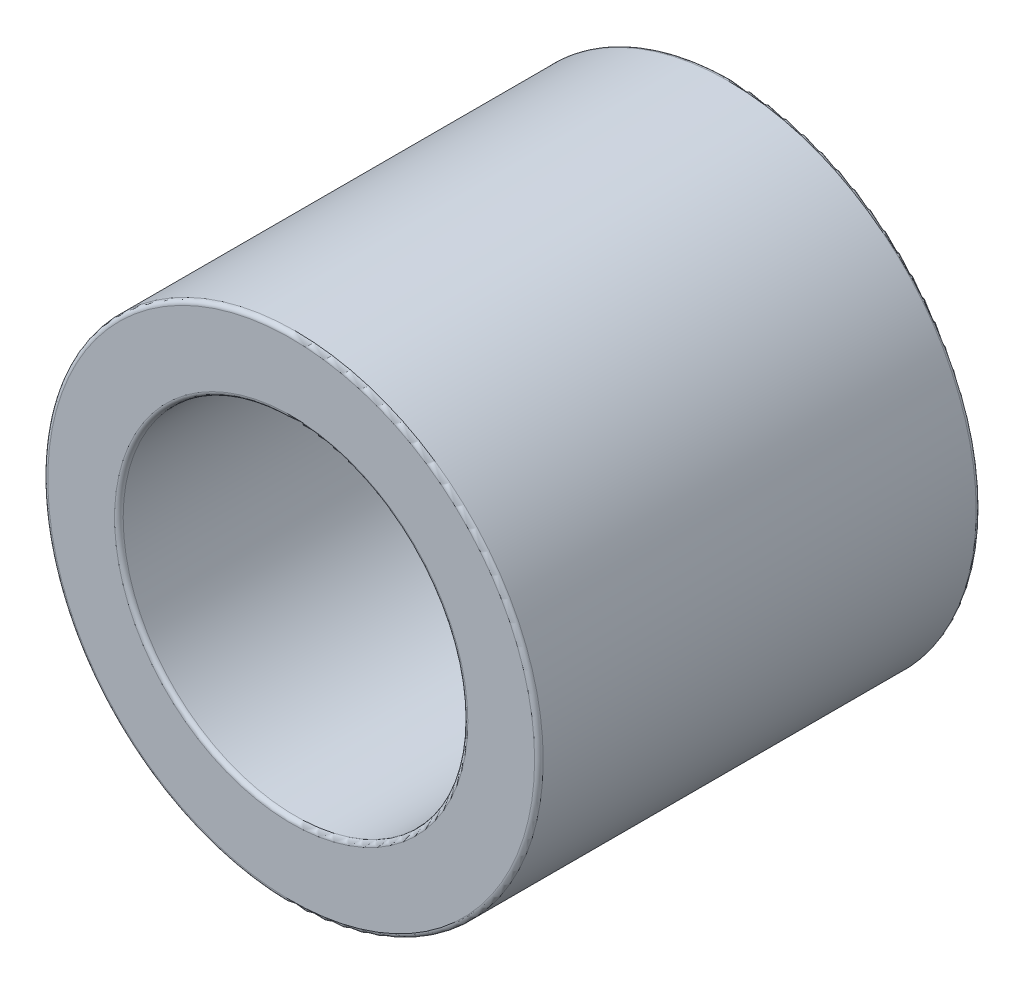
ISO-10303-21;
HEADER;
FILE_DESCRIPTION(('STEP AP214'),'2;1');
FILE_NAME('part.step','',(''),(''),'','','');
FILE_SCHEMA(('AUTOMOTIVE_DESIGN { 1 0 10303 214 1 1 1 1 }'));
ENDSEC;
DATA;
#1=APPLICATION_CONTEXT('core data for automotive mechanical design processes');
#2=APPLICATION_PROTOCOL_DEFINITION('international standard','automotive_design',2000,#1);
#3=PRODUCT_CONTEXT('',#1,'mechanical');
#4=PRODUCT('Part','Part','',(#3));
#5=PRODUCT_RELATED_PRODUCT_CATEGORY('part','',(#4));
#6=PRODUCT_DEFINITION_FORMATION('','',#4);
#7=PRODUCT_DEFINITION_CONTEXT('part definition',#1,'design');
#8=PRODUCT_DEFINITION('design','',#6,#7);
#9=PRODUCT_DEFINITION_SHAPE('','',#8);
#10=(LENGTH_UNIT() NAMED_UNIT(*) SI_UNIT(.MILLI.,.METRE.));
#11=(NAMED_UNIT(*) PLANE_ANGLE_UNIT() SI_UNIT($,.RADIAN.));
#12=(NAMED_UNIT(*) SI_UNIT($,.STERADIAN.) SOLID_ANGLE_UNIT());
#13=UNCERTAINTY_MEASURE_WITH_UNIT(LENGTH_MEASURE(1.E-05),#10,'distance_accuracy_value','');
#14=(GEOMETRIC_REPRESENTATION_CONTEXT(3) GLOBAL_UNCERTAINTY_ASSIGNED_CONTEXT((#13)) GLOBAL_UNIT_ASSIGNED_CONTEXT((#10,
#11,#12)) REPRESENTATION_CONTEXT('',''));
#15=CARTESIAN_POINT('',(0.,0.,0.));
#16=DIRECTION('',(0.,0.,1.));
#17=DIRECTION('',(1.,0.,0.));
#18=AXIS2_PLACEMENT_3D('',#15,#16,#17);
#19=CARTESIAN_POINT('',(0.,0.,5.125));
#20=DIRECTION('',(0.,0.,1.));
#21=DIRECTION('',(1.,0.,0.));
#22=AXIS2_PLACEMENT_3D('',#19,#20,#21);
#23=PLANE('',#22);
#24=CARTESIAN_POINT('',(0.,0.,5.125));
#25=DIRECTION('',(0.,0.,1.));
#26=DIRECTION('',(1.,0.,0.));
#27=AXIS2_PLACEMENT_3D('',#24,#25,#26);
#28=CIRCLE('',#27,4.1);
#29=CARTESIAN_POINT('',(4.1,0.,5.125));
#30=VERTEX_POINT('',#29);
#31=EDGE_CURVE('E52',#30,#30,#28,.F.);
#32=ORIENTED_EDGE('',*,*,#31,.T.);
#33=EDGE_LOOP('',(#32));
#34=FACE_BOUND('',#33,.T.);
#35=CARTESIAN_POINT('',(0.,0.,5.125));
#36=DIRECTION('',(0.,0.,1.));
#37=DIRECTION('',(1.,0.,0.));
#38=AXIS2_PLACEMENT_3D('',#35,#36,#37);
#39=CIRCLE('',#38,5.65);
#40=CARTESIAN_POINT('',(5.65,0.,5.125));
#41=VERTEX_POINT('',#40);
#42=EDGE_CURVE('E55',#41,#41,#39,.T.);
#43=ORIENTED_EDGE('',*,*,#42,.T.);
#44=EDGE_LOOP('',(#43));
#45=FACE_BOUND('',#44,.T.);
#46=ADVANCED_FACE('F32',(#34,#45),#23,.T.);
#47=CARTESIAN_POINT('',(0.,0.,-5.125));
#48=DIRECTION('',(0.,0.,1.));
#49=DIRECTION('',(1.,0.,0.));
#50=AXIS2_PLACEMENT_3D('',#47,#48,#49);
#51=PLANE('',#50);
#52=CARTESIAN_POINT('',(0.,0.,-5.125));
#53=DIRECTION('',(0.,0.,1.));
#54=DIRECTION('',(1.,0.,0.));
#55=AXIS2_PLACEMENT_3D('',#52,#53,#54);
#56=CIRCLE('',#55,4.1);
#57=CARTESIAN_POINT('',(4.1,0.,-5.125));
#58=VERTEX_POINT('',#57);
#59=EDGE_CURVE('E43',#58,#58,#56,.T.);
#60=ORIENTED_EDGE('',*,*,#59,.T.);
#61=EDGE_LOOP('',(#60));
#62=FACE_BOUND('',#61,.T.);
#63=CARTESIAN_POINT('',(0.,0.,-5.125));
#64=DIRECTION('',(0.,0.,1.));
#65=DIRECTION('',(1.,0.,0.));
#66=AXIS2_PLACEMENT_3D('',#63,#64,#65);
#67=CIRCLE('',#66,5.65);
#68=CARTESIAN_POINT('',(5.65,0.,-5.125));
#69=VERTEX_POINT('',#68);
#70=EDGE_CURVE('E47',#69,#69,#67,.F.);
#71=ORIENTED_EDGE('',*,*,#70,.T.);
#72=EDGE_LOOP('',(#71));
#73=FACE_BOUND('',#72,.T.);
#74=ADVANCED_FACE('F75',(#62,#73),#51,.F.);
#75=CARTESIAN_POINT('',(0.,0.,5.125));
#76=DIRECTION('',(0.,0.,-1.));
#77=DIRECTION('',(-1.,0.,0.));
#78=AXIS2_PLACEMENT_3D('',#75,#76,#77);
#79=CYLINDRICAL_SURFACE('',#78,5.75);
#80=CARTESIAN_POINT('',(0.,0.,-5.025));
#81=DIRECTION('',(0.,0.,1.));
#82=DIRECTION('',(1.,0.,0.));
#83=AXIS2_PLACEMENT_3D('',#80,#81,#82);
#84=CIRCLE('',#83,5.75);
#85=CARTESIAN_POINT('',(5.75,0.,-5.025));
#86=VERTEX_POINT('',#85);
#87=EDGE_CURVE('E10',#86,#86,#84,.T.);
#88=ORIENTED_EDGE('',*,*,#87,.T.);
#89=EDGE_LOOP('',(#88));
#90=FACE_BOUND('',#89,.T.);
#91=CARTESIAN_POINT('',(0.,0.,5.025));
#92=DIRECTION('',(0.,0.,1.));
#93=DIRECTION('',(1.,0.,0.));
#94=AXIS2_PLACEMENT_3D('',#91,#92,#93);
#95=CIRCLE('',#94,5.75);
#96=CARTESIAN_POINT('',(5.75,0.,5.025));
#97=VERTEX_POINT('',#96);
#98=EDGE_CURVE('E39',#97,#97,#95,.F.);
#99=ORIENTED_EDGE('',*,*,#98,.T.);
#100=EDGE_LOOP('',(#99));
#101=FACE_BOUND('',#100,.T.);
#102=ADVANCED_FACE('F78',(#90,#101),#79,.T.);
#103=CARTESIAN_POINT('',(0.,0.,5.125));
#104=DIRECTION('',(0.,0.,-1.));
#105=DIRECTION('',(-1.,0.,0.));
#106=AXIS2_PLACEMENT_3D('',#103,#104,#105);
#107=CYLINDRICAL_SURFACE('',#106,4.);
#108=CARTESIAN_POINT('',(0.,0.,5.025));
#109=DIRECTION('',(0.,0.,1.));
#110=DIRECTION('',(1.,0.,0.));
#111=AXIS2_PLACEMENT_3D('',#108,#109,#110);
#112=CIRCLE('',#111,4.);
#113=CARTESIAN_POINT('',(4.,0.,5.025));
#114=VERTEX_POINT('',#113);
#115=EDGE_CURVE('E58',#114,#114,#112,.T.);
#116=ORIENTED_EDGE('',*,*,#115,.T.);
#117=EDGE_LOOP('',(#116));
#118=FACE_BOUND('',#117,.T.);
#119=CARTESIAN_POINT('',(0.,0.,-5.025));
#120=DIRECTION('',(0.,0.,1.));
#121=DIRECTION('',(1.,0.,0.));
#122=AXIS2_PLACEMENT_3D('',#119,#120,#121);
#123=CIRCLE('',#122,4.);
#124=CARTESIAN_POINT('',(4.,0.,-5.025));
#125=VERTEX_POINT('',#124);
#126=EDGE_CURVE('E61',#125,#125,#123,.F.);
#127=ORIENTED_EDGE('',*,*,#126,.T.);
#128=EDGE_LOOP('',(#127));
#129=FACE_BOUND('',#128,.T.);
#130=ADVANCED_FACE('F65',(#118,#129),#107,.F.);
#131=CARTESIAN_POINT('',(0.,0.,5.025));
#132=DIRECTION('',(0.,0.,1.));
#133=DIRECTION('',(1.,0.,0.));
#134=AXIS2_PLACEMENT_3D('',#131,#132,#133);
#135=TOROIDAL_SURFACE('',#134,4.1,0.1);
#136=ORIENTED_EDGE('',*,*,#31,.F.);
#137=EDGE_LOOP('',(#136));
#138=FACE_BOUND('',#137,.T.);
#139=ORIENTED_EDGE('',*,*,#115,.F.);
#140=EDGE_LOOP('',(#139));
#141=FACE_BOUND('',#140,.T.);
#142=ADVANCED_FACE('F71',(#138,#141),#135,.T.);
#143=CARTESIAN_POINT('',(0.,0.,-5.025));
#144=DIRECTION('',(0.,0.,1.));
#145=DIRECTION('',(1.,0.,0.));
#146=AXIS2_PLACEMENT_3D('',#143,#144,#145);
#147=TOROIDAL_SURFACE('',#146,4.1,0.1);
#148=ORIENTED_EDGE('',*,*,#126,.F.);
#149=EDGE_LOOP('',(#148));
#150=FACE_BOUND('',#149,.T.);
#151=ORIENTED_EDGE('',*,*,#59,.F.);
#152=EDGE_LOOP('',(#151));
#153=FACE_BOUND('',#152,.T.);
#154=ADVANCED_FACE('F67',(#150,#153),#147,.T.);
#155=CARTESIAN_POINT('',(0.,0.,-5.025));
#156=DIRECTION('',(0.,0.,1.));
#157=DIRECTION('',(1.,0.,0.));
#158=AXIS2_PLACEMENT_3D('',#155,#156,#157);
#159=TOROIDAL_SURFACE('',#158,5.65,0.1);
#160=ORIENTED_EDGE('',*,*,#70,.F.);
#161=EDGE_LOOP('',(#160));
#162=FACE_BOUND('',#161,.T.);
#163=ORIENTED_EDGE('',*,*,#87,.F.);
#164=EDGE_LOOP('',(#163));
#165=FACE_BOUND('',#164,.T.);
#166=ADVANCED_FACE('F70',(#162,#165),#159,.T.);
#167=CARTESIAN_POINT('',(0.,0.,5.025));
#168=DIRECTION('',(0.,0.,1.));
#169=DIRECTION('',(1.,0.,0.));
#170=AXIS2_PLACEMENT_3D('',#167,#168,#169);
#171=TOROIDAL_SURFACE('',#170,5.65,0.1);
#172=ORIENTED_EDGE('',*,*,#98,.F.);
#173=EDGE_LOOP('',(#172));
#174=FACE_BOUND('',#173,.T.);
#175=ORIENTED_EDGE('',*,*,#42,.F.);
#176=EDGE_LOOP('',(#175));
#177=FACE_BOUND('',#176,.T.);
#178=ADVANCED_FACE('F34',(#174,#177),#171,.T.);
#179=CLOSED_SHELL('',(#46,#74,#102,#130,#142,#154,#166,#178));
#180=MANIFOLD_SOLID_BREP('B2',#179);
#181=ADVANCED_BREP_SHAPE_REPRESENTATION('',(#18,#180),#14);
#182=SHAPE_DEFINITION_REPRESENTATION(#9,#181);
ENDSEC;
END-ISO-10303-21;
